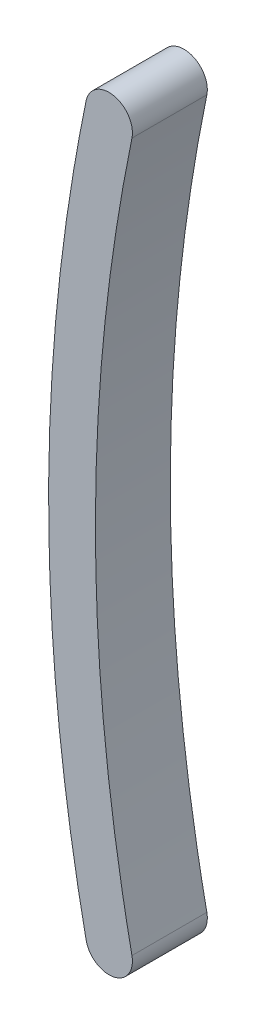
ISO-10303-21;
HEADER;
FILE_DESCRIPTION(('STEP AP214'),'2;1');
FILE_NAME('part.step','',(''),(''),'','','');
FILE_SCHEMA(('AUTOMOTIVE_DESIGN { 1 0 10303 214 1 1 1 1 }'));
ENDSEC;
DATA;
#1=APPLICATION_CONTEXT('core data for automotive mechanical design processes');
#2=APPLICATION_PROTOCOL_DEFINITION('international standard','automotive_design',2000,#1);
#3=PRODUCT_CONTEXT('',#1,'mechanical');
#4=PRODUCT('Part','Part','',(#3));
#5=PRODUCT_RELATED_PRODUCT_CATEGORY('part','',(#4));
#6=PRODUCT_DEFINITION_FORMATION('','',#4);
#7=PRODUCT_DEFINITION_CONTEXT('part definition',#1,'design');
#8=PRODUCT_DEFINITION('design','',#6,#7);
#9=PRODUCT_DEFINITION_SHAPE('','',#8);
#10=(LENGTH_UNIT() NAMED_UNIT(*) SI_UNIT(.MILLI.,.METRE.));
#11=(NAMED_UNIT(*) PLANE_ANGLE_UNIT() SI_UNIT($,.RADIAN.));
#12=(NAMED_UNIT(*) SI_UNIT($,.STERADIAN.) SOLID_ANGLE_UNIT());
#13=UNCERTAINTY_MEASURE_WITH_UNIT(LENGTH_MEASURE(1.E-05),#10,'distance_accuracy_value','');
#14=(GEOMETRIC_REPRESENTATION_CONTEXT(3) GLOBAL_UNCERTAINTY_ASSIGNED_CONTEXT((#13)) GLOBAL_UNIT_ASSIGNED_CONTEXT((#10,
#11,#12)) REPRESENTATION_CONTEXT('',''));
#15=CARTESIAN_POINT('',(0.,0.,0.));
#16=DIRECTION('',(0.,0.,1.));
#17=DIRECTION('',(1.,0.,0.));
#18=AXIS2_PLACEMENT_3D('',#15,#16,#17);
#19=CARTESIAN_POINT('',(-20.2474352886467,-12.388865244189,2.54));
#20=CARTESIAN_POINT('',(-22.7908541535567,-0.0624660154207194,2.54));
#21=CARTESIAN_POINT('',(-20.2474352552439,12.2639332302882,2.54));
#22=B_SPLINE_CURVE_WITH_KNOTS('',2,(#19,#20,#21),.UNSPECIFIED.,.F.,.F.,(3,3),(0.,1.),.UNSPECIFIED.);
#23=DIRECTION('',(0.,0.,-1.));
#24=VECTOR('',#23,1.);
#25=SURFACE_OF_LINEAR_EXTRUSION('',#22,#24);
#26=CARTESIAN_POINT('',(-20.2474352886467,-12.388865244189,0.));
#27=CARTESIAN_POINT('',(-22.7908541535567,-0.0624660154207194,0.));
#28=CARTESIAN_POINT('',(-20.2474352552439,12.2639332302882,0.));
#29=B_SPLINE_CURVE_WITH_KNOTS('',2,(#26,#27,#28),.UNSPECIFIED.,.F.,.F.,(3,3),(0.,1.),.UNSPECIFIED.);
#30=CARTESIAN_POINT('',(-20.2474352886467,-12.388865244189,0.));
#31=VERTEX_POINT('',#30);
#32=CARTESIAN_POINT('',(-20.2474352552439,12.2639332302882,0.));
#33=VERTEX_POINT('',#32);
#34=EDGE_CURVE('E90',#31,#33,#29,.T.);
#35=ORIENTED_EDGE('',*,*,#34,.F.);
#36=DIRECTION('',(0.,0.,-1.));
#37=VECTOR('',#36,1.);
#38=CARTESIAN_POINT('',(-20.2474352886467,-12.388865244189,2.54));
#39=LINE('',#38,#37);
#40=CARTESIAN_POINT('',(-20.2474352886467,-12.388865244189,2.54));
#41=VERTEX_POINT('',#40);
#42=EDGE_CURVE('E50',#41,#31,#39,.T.);
#43=ORIENTED_EDGE('',*,*,#42,.F.);
#44=CARTESIAN_POINT('',(-20.2474352552439,12.2639332302882,2.54));
#45=VERTEX_POINT('',#44);
#46=EDGE_CURVE('E93',#41,#45,#22,.T.);
#47=ORIENTED_EDGE('',*,*,#46,.T.);
#48=DIRECTION('',(0.,0.,-1.));
#49=VECTOR('',#48,1.);
#50=CARTESIAN_POINT('',(-20.2474352552439,12.2639332302882,2.54));
#51=LINE('',#50,#49);
#52=EDGE_CURVE('E42',#45,#33,#51,.T.);
#53=ORIENTED_EDGE('',*,*,#52,.T.);
#54=EDGE_LOOP('',(#35,#43,#47,#53));
#55=FACE_BOUND('',#54,.T.);
#56=ADVANCED_FACE('F33',(#55),#25,.T.);
#57=CARTESIAN_POINT('',(-18.979144712751,-0.0624660146270916,2.54));
#58=DIRECTION('',(0.,0.,1.));
#59=DIRECTION('',(1.,0.,0.));
#60=AXIS2_PLACEMENT_3D('',#57,#58,#59);
#61=PLANE('',#60);
#62=CARTESIAN_POINT('',(-18.6926876249472,11.9431279060072,2.54));
#63=CARTESIAN_POINT('',(-19.1020255073284,9.95931699498449,2.54));
#64=CARTESIAN_POINT('',(-19.7273631653019,5.92868296880965,2.54));
#65=CARTESIAN_POINT('',(-20.0337854824748,-0.0624660100544236,2.54));
#66=CARTESIAN_POINT('',(-19.7273631815006,-6.0536149886817,2.54));
#67=CARTESIAN_POINT('',(-19.1020255345996,-10.0842490131362,2.54));
#68=CARTESIAN_POINT('',(-18.6926876575351,-12.0680599238579,2.54));
#69=B_SPLINE_CURVE_WITH_KNOTS('',3,(#62,#63,#64,#65,#66,#67,#68),.UNSPECIFIED.,.F.,.F.,(4,1,1,1,
4),(0.,0.25,0.5,0.75,1.),.UNSPECIFIED.);
#70=CARTESIAN_POINT('',(-18.6926876249472,11.9431279060072,2.54));
#71=VERTEX_POINT('',#70);
#72=CARTESIAN_POINT('',(-18.6926876575351,-12.0680599238579,2.54));
#73=VERTEX_POINT('',#72);
#74=EDGE_CURVE('E75',#71,#73,#69,.T.);
#75=ORIENTED_EDGE('',*,*,#74,.F.);
#76=CARTESIAN_POINT('',(-19.4700614540643,12.1035305004361,2.54));
#77=DIRECTION('',(0.,0.,-1.));
#78=DIRECTION('',(1.,0.,0.));
#79=AXIS2_PLACEMENT_3D('',#76,#77,#78);
#80=CIRCLE('',#79,0.793750000000003);
#81=EDGE_CURVE('E89',#45,#71,#80,.T.);
#82=ORIENTED_EDGE('',*,*,#81,.F.);
#83=ORIENTED_EDGE('',*,*,#46,.F.);
#84=CARTESIAN_POINT('',(-19.4700614743849,-12.2284625777525,2.54));
#85=DIRECTION('',(0.,0.,-1.));
#86=DIRECTION('',(1.,0.,0.));
#87=AXIS2_PLACEMENT_3D('',#84,#85,#86);
#88=CIRCLE('',#87,0.793749999999902);
#89=EDGE_CURVE('E77',#73,#41,#88,.T.);
#90=ORIENTED_EDGE('',*,*,#89,.F.);
#91=EDGE_LOOP('',(#75,#82,#83,#90));
#92=FACE_BOUND('',#91,.T.);
#93=ADVANCED_FACE('F113',(#92),#61,.T.);
#94=CARTESIAN_POINT('',(-18.979144712751,-0.0624660146270916,0.));
#95=DIRECTION('',(0.,0.,1.));
#96=DIRECTION('',(1.,0.,0.));
#97=AXIS2_PLACEMENT_3D('',#94,#95,#96);
#98=PLANE('',#97);
#99=CARTESIAN_POINT('',(-19.4700614540643,12.1035305004361,0.));
#100=DIRECTION('',(0.,0.,-1.));
#101=DIRECTION('',(1.,0.,0.));
#102=AXIS2_PLACEMENT_3D('',#99,#100,#101);
#103=CIRCLE('',#102,0.793750000000003);
#104=CARTESIAN_POINT('',(-18.6926876249472,11.9431279060072,0.));
#105=VERTEX_POINT('',#104);
#106=EDGE_CURVE('E86',#33,#105,#103,.T.);
#107=ORIENTED_EDGE('',*,*,#106,.T.);
#108=CARTESIAN_POINT('',(-18.6926876249472,11.9431279060072,0.));
#109=CARTESIAN_POINT('',(-19.1020255073284,9.95931699498449,0.));
#110=CARTESIAN_POINT('',(-19.7273631653019,5.92868296880965,0.));
#111=CARTESIAN_POINT('',(-20.0337854824748,-0.0624660100544236,0.));
#112=CARTESIAN_POINT('',(-19.7273631815006,-6.0536149886817,0.));
#113=CARTESIAN_POINT('',(-19.1020255345996,-10.0842490131362,0.));
#114=CARTESIAN_POINT('',(-18.6926876575351,-12.0680599238579,0.));
#115=B_SPLINE_CURVE_WITH_KNOTS('',3,(#108,#109,#110,#111,#112,#113,#114),.UNSPECIFIED.,.F.,.F.,
(4,1,1,1,4),(0.,0.25,0.5,0.75,1.),.UNSPECIFIED.);
#116=CARTESIAN_POINT('',(-18.6926876670236,-12.0680598778738,0.));
#117=VERTEX_POINT('',#116);
#118=EDGE_CURVE('E72',#105,#117,#115,.T.);
#119=ORIENTED_EDGE('',*,*,#118,.T.);
#120=CARTESIAN_POINT('',(-19.4700614743849,-12.2284625777525,0.));
#121=DIRECTION('',(0.,0.,-1.));
#122=DIRECTION('',(1.,0.,0.));
#123=AXIS2_PLACEMENT_3D('',#120,#121,#122);
#124=CIRCLE('',#123,0.793749999999902);
#125=EDGE_CURVE('E84',#117,#31,#124,.T.);
#126=ORIENTED_EDGE('',*,*,#125,.T.);
#127=ORIENTED_EDGE('',*,*,#34,.T.);
#128=EDGE_LOOP('',(#107,#119,#126,#127));
#129=FACE_BOUND('',#128,.T.);
#130=ADVANCED_FACE('F82',(#129),#98,.F.);
#131=CARTESIAN_POINT('',(-19.4700614743849,-12.2284625777525,2.54));
#132=DIRECTION('',(0.,0.,-1.));
#133=DIRECTION('',(-1.,0.,0.));
#134=AXIS2_PLACEMENT_3D('',#131,#132,#133);
#135=CYLINDRICAL_SURFACE('',#134,0.793749999999902);
#136=ORIENTED_EDGE('',*,*,#125,.F.);
#137=DIRECTION('',(0.,0.,-1.));
#138=VECTOR('',#137,1.);
#139=CARTESIAN_POINT('',(-18.6926876670236,-12.0680598778738,2.54));
#140=LINE('',#139,#138);
#141=EDGE_CURVE('E68',#73,#117,#140,.T.);
#142=ORIENTED_EDGE('',*,*,#141,.F.);
#143=ORIENTED_EDGE('',*,*,#89,.T.);
#144=ORIENTED_EDGE('',*,*,#42,.T.);
#145=EDGE_LOOP('',(#136,#142,#143,#144));
#146=FACE_BOUND('',#145,.T.);
#147=ADVANCED_FACE('F88',(#146),#135,.T.);
#148=CARTESIAN_POINT('',(-19.4700614540643,12.1035305004361,2.54));
#149=DIRECTION('',(0.,0.,-1.));
#150=DIRECTION('',(-1.,0.,0.));
#151=AXIS2_PLACEMENT_3D('',#148,#149,#150);
#152=CYLINDRICAL_SURFACE('',#151,0.793750000000003);
#153=ORIENTED_EDGE('',*,*,#106,.F.);
#154=ORIENTED_EDGE('',*,*,#52,.F.);
#155=ORIENTED_EDGE('',*,*,#81,.T.);
#156=DIRECTION('',(0.,0.,-1.));
#157=VECTOR('',#156,1.);
#158=CARTESIAN_POINT('',(-18.6926876249087,11.9431279061804,2.54));
#159=LINE('',#158,#157);
#160=EDGE_CURVE('E11',#71,#105,#159,.T.);
#161=ORIENTED_EDGE('',*,*,#160,.T.);
#162=EDGE_LOOP('',(#153,#154,#155,#161));
#163=FACE_BOUND('',#162,.T.);
#164=ADVANCED_FACE('F35',(#163),#152,.T.);
#165=DIRECTION('',(0.,0.,1.));
#166=VECTOR('',#165,1.);
#167=SURFACE_OF_LINEAR_EXTRUSION('',#115,#166);
#168=ORIENTED_EDGE('',*,*,#74,.T.);
#169=ORIENTED_EDGE('',*,*,#141,.T.);
#170=ORIENTED_EDGE('',*,*,#118,.F.);
#171=ORIENTED_EDGE('',*,*,#160,.F.);
#172=EDGE_LOOP('',(#168,#169,#170,#171));
#173=FACE_BOUND('',#172,.T.);
#174=ADVANCED_FACE('F70',(#173),#167,.F.);
#175=CLOSED_SHELL('',(#56,#93,#130,#147,#164,#174));
#176=MANIFOLD_SOLID_BREP('B2',#175);
#177=ADVANCED_BREP_SHAPE_REPRESENTATION('',(#18,#176),#14);
#178=SHAPE_DEFINITION_REPRESENTATION(#9,#177);
ENDSEC;
END-ISO-10303-21;
